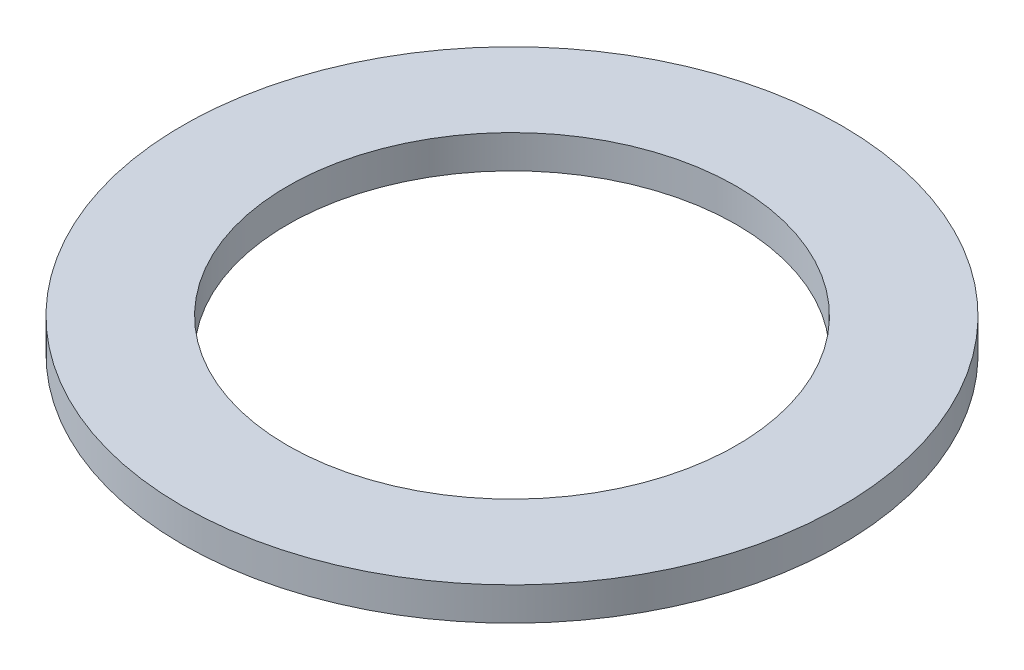
ISO-10303-21;
HEADER;
FILE_DESCRIPTION(('STEP AP214'),'2;1');
FILE_NAME('part.step','',(''),(''),'','','');
FILE_SCHEMA(('AUTOMOTIVE_DESIGN { 1 0 10303 214 1 1 1 1 }'));
ENDSEC;
DATA;
#1=APPLICATION_CONTEXT('core data for automotive mechanical design processes');
#2=APPLICATION_PROTOCOL_DEFINITION('international standard','automotive_design',2000,#1);
#3=PRODUCT_CONTEXT('',#1,'mechanical');
#4=PRODUCT('Part','Part','',(#3));
#5=PRODUCT_RELATED_PRODUCT_CATEGORY('part','',(#4));
#6=PRODUCT_DEFINITION_FORMATION('','',#4);
#7=PRODUCT_DEFINITION_CONTEXT('part definition',#1,'design');
#8=PRODUCT_DEFINITION('design','',#6,#7);
#9=PRODUCT_DEFINITION_SHAPE('','',#8);
#10=(LENGTH_UNIT() NAMED_UNIT(*) SI_UNIT(.MILLI.,.METRE.));
#11=(NAMED_UNIT(*) PLANE_ANGLE_UNIT() SI_UNIT($,.RADIAN.));
#12=(NAMED_UNIT(*) SI_UNIT($,.STERADIAN.) SOLID_ANGLE_UNIT());
#13=UNCERTAINTY_MEASURE_WITH_UNIT(LENGTH_MEASURE(1.E-05),#10,'distance_accuracy_value','');
#14=(GEOMETRIC_REPRESENTATION_CONTEXT(3) GLOBAL_UNCERTAINTY_ASSIGNED_CONTEXT((#13)) GLOBAL_UNIT_ASSIGNED_CONTEXT((#10,
#11,#12)) REPRESENTATION_CONTEXT('',''));
#15=CARTESIAN_POINT('',(0.,0.,0.));
#16=DIRECTION('',(0.,0.,1.));
#17=DIRECTION('',(1.,0.,0.));
#18=AXIS2_PLACEMENT_3D('',#15,#16,#17);
#19=CARTESIAN_POINT('',(0.,3.,0.));
#20=DIRECTION('',(0.,1.,0.));
#21=DIRECTION('',(0.,0.,1.));
#22=AXIS2_PLACEMENT_3D('',#19,#20,#21);
#23=PLANE('',#22);
#24=CARTESIAN_POINT('',(0.,3.,0.));
#25=DIRECTION('',(0.,1.,0.));
#26=DIRECTION('',(0.,0.,1.));
#27=AXIS2_PLACEMENT_3D('',#24,#25,#26);
#28=CIRCLE('',#27,29.8);
#29=CARTESIAN_POINT('',(0.,3.,29.8));
#30=VERTEX_POINT('',#29);
#31=EDGE_CURVE('E10',#30,#30,#28,.T.);
#32=ORIENTED_EDGE('',*,*,#31,.T.);
#33=EDGE_LOOP('',(#32));
#34=FACE_BOUND('',#33,.T.);
#35=CARTESIAN_POINT('',(0.,3.,0.));
#36=DIRECTION('',(0.,1.,0.));
#37=DIRECTION('',(0.,0.,1.));
#38=AXIS2_PLACEMENT_3D('',#35,#36,#37);
#39=CIRCLE('',#38,20.3);
#40=CARTESIAN_POINT('',(0.,3.,20.3));
#41=VERTEX_POINT('',#40);
#42=EDGE_CURVE('E42',#41,#41,#39,.T.);
#43=ORIENTED_EDGE('',*,*,#42,.F.);
#44=EDGE_LOOP('',(#43));
#45=FACE_BOUND('',#44,.T.);
#46=ADVANCED_FACE('F31',(#34,#45),#23,.T.);
#47=CARTESIAN_POINT('',(0.,0.,0.));
#48=DIRECTION('',(0.,1.,0.));
#49=DIRECTION('',(0.,0.,1.));
#50=AXIS2_PLACEMENT_3D('',#47,#48,#49);
#51=PLANE('',#50);
#52=CARTESIAN_POINT('',(0.,0.,0.));
#53=DIRECTION('',(0.,1.,0.));
#54=DIRECTION('',(0.,0.,1.));
#55=AXIS2_PLACEMENT_3D('',#52,#53,#54);
#56=CIRCLE('',#55,29.8);
#57=CARTESIAN_POINT('',(0.,0.,29.8));
#58=VERTEX_POINT('',#57);
#59=EDGE_CURVE('E35',#58,#58,#56,.T.);
#60=ORIENTED_EDGE('',*,*,#59,.F.);
#61=EDGE_LOOP('',(#60));
#62=FACE_BOUND('',#61,.T.);
#63=CARTESIAN_POINT('',(0.,0.,0.));
#64=DIRECTION('',(0.,1.,0.));
#65=DIRECTION('',(0.,0.,1.));
#66=AXIS2_PLACEMENT_3D('',#63,#64,#65);
#67=CIRCLE('',#66,20.3);
#68=CARTESIAN_POINT('',(0.,0.,20.3));
#69=VERTEX_POINT('',#68);
#70=EDGE_CURVE('E44',#69,#69,#67,.T.);
#71=ORIENTED_EDGE('',*,*,#70,.T.);
#72=EDGE_LOOP('',(#71));
#73=FACE_BOUND('',#72,.T.);
#74=ADVANCED_FACE('F54',(#62,#73),#51,.F.);
#75=CARTESIAN_POINT('',(0.,3.,0.));
#76=DIRECTION('',(0.,-1.,0.));
#77=DIRECTION('',(0.,0.,-1.));
#78=AXIS2_PLACEMENT_3D('',#75,#76,#77);
#79=CYLINDRICAL_SURFACE('',#78,29.8);
#80=ORIENTED_EDGE('',*,*,#31,.F.);
#81=EDGE_LOOP('',(#80));
#82=FACE_BOUND('',#81,.T.);
#83=ORIENTED_EDGE('',*,*,#59,.T.);
#84=EDGE_LOOP('',(#83));
#85=FACE_BOUND('',#84,.T.);
#86=ADVANCED_FACE('F33',(#82,#85),#79,.T.);
#87=CARTESIAN_POINT('',(0.,3.,0.));
#88=DIRECTION('',(0.,-1.,0.));
#89=DIRECTION('',(0.,0.,-1.));
#90=AXIS2_PLACEMENT_3D('',#87,#88,#89);
#91=CYLINDRICAL_SURFACE('',#90,20.3);
#92=ORIENTED_EDGE('',*,*,#42,.T.);
#93=EDGE_LOOP('',(#92));
#94=FACE_BOUND('',#93,.T.);
#95=ORIENTED_EDGE('',*,*,#70,.F.);
#96=EDGE_LOOP('',(#95));
#97=FACE_BOUND('',#96,.T.);
#98=ADVANCED_FACE('F50',(#94,#97),#91,.F.);
#99=CLOSED_SHELL('',(#46,#74,#86,#98));
#100=MANIFOLD_SOLID_BREP('B2',#99);
#101=ADVANCED_BREP_SHAPE_REPRESENTATION('',(#18,#100),#14);
#102=SHAPE_DEFINITION_REPRESENTATION(#9,#101);
ENDSEC;
END-ISO-10303-21;
